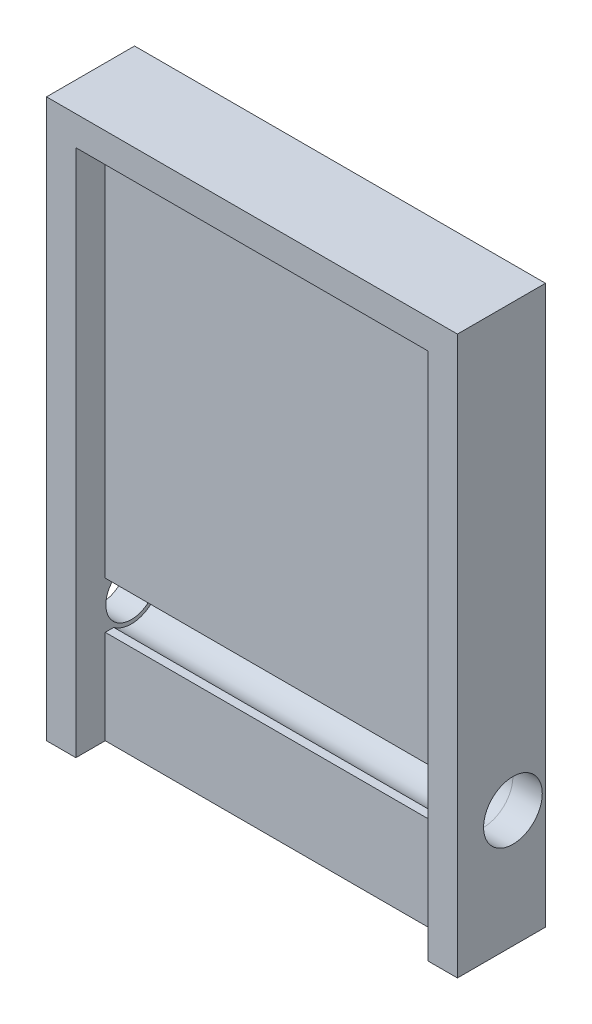
ISO-10303-21;
HEADER;
FILE_DESCRIPTION(('STEP AP214'),'2;1');
FILE_NAME('part.step','',(''),(''),'','','');
FILE_SCHEMA(('AUTOMOTIVE_DESIGN { 1 0 10303 214 1 1 1 1 }'));
ENDSEC;
DATA;
#1=APPLICATION_CONTEXT('core data for automotive mechanical design processes');
#2=APPLICATION_PROTOCOL_DEFINITION('international standard','automotive_design',2000,#1);
#3=PRODUCT_CONTEXT('',#1,'mechanical');
#4=PRODUCT('Part','Part','',(#3));
#5=PRODUCT_RELATED_PRODUCT_CATEGORY('part','',(#4));
#6=PRODUCT_DEFINITION_FORMATION('','',#4);
#7=PRODUCT_DEFINITION_CONTEXT('part definition',#1,'design');
#8=PRODUCT_DEFINITION('design','',#6,#7);
#9=PRODUCT_DEFINITION_SHAPE('','',#8);
#10=(LENGTH_UNIT() NAMED_UNIT(*) SI_UNIT(.MILLI.,.METRE.));
#11=(NAMED_UNIT(*) PLANE_ANGLE_UNIT() SI_UNIT($,.RADIAN.));
#12=(NAMED_UNIT(*) SI_UNIT($,.STERADIAN.) SOLID_ANGLE_UNIT());
#13=UNCERTAINTY_MEASURE_WITH_UNIT(LENGTH_MEASURE(1.E-05),#10,'distance_accuracy_value','');
#14=(GEOMETRIC_REPRESENTATION_CONTEXT(3) GLOBAL_UNCERTAINTY_ASSIGNED_CONTEXT((#13)) GLOBAL_UNIT_ASSIGNED_CONTEXT((#10,
#11,#12)) REPRESENTATION_CONTEXT('',''));
#15=CARTESIAN_POINT('',(0.,0.,0.));
#16=DIRECTION('',(0.,0.,1.));
#17=DIRECTION('',(1.,0.,0.));
#18=AXIS2_PLACEMENT_3D('',#15,#16,#17);
#19=CARTESIAN_POINT('',(0.,0.,10.));
#20=DIRECTION('',(0.,0.,-1.));
#21=DIRECTION('',(-1.,0.,0.));
#22=AXIS2_PLACEMENT_3D('',#19,#20,#21);
#23=PLANE('',#22);
#24=DIRECTION('',(0.,1.,0.));
#25=VECTOR('',#24,1.);
#26=CARTESIAN_POINT('',(30.,-47.5,10.));
#27=LINE('',#26,#25);
#28=CARTESIAN_POINT('',(30.,-47.5,10.));
#29=VERTEX_POINT('',#28);
#30=CARTESIAN_POINT('',(30.,-31.5,10.));
#31=VERTEX_POINT('',#30);
#32=EDGE_CURVE('E205',#29,#31,#27,.T.);
#33=ORIENTED_EDGE('',*,*,#32,.T.);
#34=DIRECTION('',(1.,0.,0.));
#35=VECTOR('',#34,1.);
#36=CARTESIAN_POINT('',(-30.,-31.5,10.));
#37=LINE('',#36,#35);
#38=CARTESIAN_POINT('',(-30.,-31.5,10.));
#39=VERTEX_POINT('',#38);
#40=EDGE_CURVE('E179',#39,#31,#37,.T.);
#41=ORIENTED_EDGE('',*,*,#40,.F.);
#42=DIRECTION('',(0.,-1.,0.));
#43=VECTOR('',#42,1.);
#44=CARTESIAN_POINT('',(-30.,-47.5,10.));
#45=LINE('',#44,#43);
#46=CARTESIAN_POINT('',(-30.,-47.5,10.));
#47=VERTEX_POINT('',#46);
#48=EDGE_CURVE('E200',#39,#47,#45,.T.);
#49=ORIENTED_EDGE('',*,*,#48,.T.);
#50=DIRECTION('',(1.,0.,0.));
#51=VECTOR('',#50,1.);
#52=CARTESIAN_POINT('',(-30.,-47.5,10.));
#53=LINE('',#52,#51);
#54=EDGE_CURVE('E199',#47,#29,#53,.T.);
#55=ORIENTED_EDGE('',*,*,#54,.T.);
#56=EDGE_LOOP('',(#33,#41,#49,#55));
#57=FACE_BOUND('',#56,.T.);
#58=ADVANCED_FACE('F45',(#57),#23,.F.);
#59=CARTESIAN_POINT('',(35.,47.5,15.));
#60=DIRECTION('',(0.,-1.,0.));
#61=DIRECTION('',(0.,0.,-1.));
#62=AXIS2_PLACEMENT_3D('',#59,#60,#61);
#63=PLANE('',#62);
#64=DIRECTION('',(-1.,0.,0.));
#65=VECTOR('',#64,1.);
#66=CARTESIAN_POINT('',(35.,47.5,0.));
#67=LINE('',#66,#65);
#68=CARTESIAN_POINT('',(35.,47.5,0.));
#69=VERTEX_POINT('',#68);
#70=CARTESIAN_POINT('',(-35.,47.5,0.));
#71=VERTEX_POINT('',#70);
#72=EDGE_CURVE('E227',#69,#71,#67,.T.);
#73=ORIENTED_EDGE('',*,*,#72,.T.);
#74=DIRECTION('',(0.,0.,-1.));
#75=VECTOR('',#74,1.);
#76=CARTESIAN_POINT('',(-35.,47.5,15.));
#77=LINE('',#76,#75);
#78=CARTESIAN_POINT('',(-35.,47.5,15.));
#79=VERTEX_POINT('',#78);
#80=EDGE_CURVE('E55',#79,#71,#77,.T.);
#81=ORIENTED_EDGE('',*,*,#80,.F.);
#82=DIRECTION('',(-1.,0.,0.));
#83=VECTOR('',#82,1.);
#84=CARTESIAN_POINT('',(35.,47.5,15.));
#85=LINE('',#84,#83);
#86=CARTESIAN_POINT('',(35.,47.5,15.));
#87=VERTEX_POINT('',#86);
#88=EDGE_CURVE('E237',#87,#79,#85,.T.);
#89=ORIENTED_EDGE('',*,*,#88,.F.);
#90=DIRECTION('',(0.,0.,-1.));
#91=VECTOR('',#90,1.);
#92=CARTESIAN_POINT('',(35.,47.5,15.));
#93=LINE('',#92,#91);
#94=EDGE_CURVE('E253',#87,#69,#93,.T.);
#95=ORIENTED_EDGE('',*,*,#94,.T.);
#96=EDGE_LOOP('',(#73,#81,#89,#95));
#97=FACE_BOUND('',#96,.T.);
#98=ADVANCED_FACE('F47',(#97),#63,.F.);
#99=CARTESIAN_POINT('',(-35.,-47.5,15.));
#100=DIRECTION('',(1.,0.,0.));
#101=DIRECTION('',(0.,0.,-1.));
#102=AXIS2_PLACEMENT_3D('',#99,#100,#101);
#103=PLANE('',#102);
#104=CARTESIAN_POINT('',(-35.,-27.5,5.54651922487887));
#105=DIRECTION('',(-1.,0.,0.));
#106=DIRECTION('',(0.,0.,1.));
#107=AXIS2_PLACEMENT_3D('',#104,#105,#106);
#108=CIRCLE('',#107,4.35);
#109=CARTESIAN_POINT('',(-35.,-27.5,9.89651922487887));
#110=VERTEX_POINT('',#109);
#111=EDGE_CURVE('E375',#110,#110,#108,.T.);
#112=ORIENTED_EDGE('',*,*,#111,.F.);
#113=EDGE_LOOP('',(#112));
#114=FACE_BOUND('',#113,.T.);
#115=DIRECTION('',(0.,-1.,0.));
#116=VECTOR('',#115,1.);
#117=CARTESIAN_POINT('',(-35.,-47.5,0.));
#118=LINE('',#117,#116);
#119=CARTESIAN_POINT('',(-35.,-47.5,0.));
#120=VERTEX_POINT('',#119);
#121=EDGE_CURVE('E257',#71,#120,#118,.T.);
#122=ORIENTED_EDGE('',*,*,#121,.T.);
#123=DIRECTION('',(0.,0.,-1.));
#124=VECTOR('',#123,1.);
#125=CARTESIAN_POINT('',(-35.,-47.5,15.));
#126=LINE('',#125,#124);
#127=CARTESIAN_POINT('',(-35.,-47.5,15.));
#128=VERTEX_POINT('',#127);
#129=EDGE_CURVE('E272',#128,#120,#126,.T.);
#130=ORIENTED_EDGE('',*,*,#129,.F.);
#131=DIRECTION('',(0.,-1.,0.));
#132=VECTOR('',#131,1.);
#133=CARTESIAN_POINT('',(-35.,-47.5,15.));
#134=LINE('',#133,#132);
#135=EDGE_CURVE('E241',#79,#128,#134,.T.);
#136=ORIENTED_EDGE('',*,*,#135,.F.);
#137=ORIENTED_EDGE('',*,*,#80,.T.);
#138=EDGE_LOOP('',(#122,#130,#136,#137));
#139=FACE_BOUND('',#138,.T.);
#140=ADVANCED_FACE('F280',(#114,#139),#103,.F.);
#141=CARTESIAN_POINT('',(35.,-47.5,15.));
#142=DIRECTION('',(0.,1.,0.));
#143=DIRECTION('',(0.,0.,1.));
#144=AXIS2_PLACEMENT_3D('',#141,#142,#143);
#145=PLANE('',#144);
#146=ORIENTED_EDGE('',*,*,#54,.F.);
#147=DIRECTION('',(0.,0.,1.));
#148=VECTOR('',#147,1.);
#149=CARTESIAN_POINT('',(-30.,-47.5,10.));
#150=LINE('',#149,#148);
#151=CARTESIAN_POINT('',(-30.,-47.5,15.));
#152=VERTEX_POINT('',#151);
#153=EDGE_CURVE('E213',#47,#152,#150,.T.);
#154=ORIENTED_EDGE('',*,*,#153,.T.);
#155=DIRECTION('',(1.,0.,0.));
#156=VECTOR('',#155,1.);
#157=CARTESIAN_POINT('',(35.,-47.5,15.));
#158=LINE('',#157,#156);
#159=EDGE_CURVE('E246',#128,#152,#158,.T.);
#160=ORIENTED_EDGE('',*,*,#159,.F.);
#161=ORIENTED_EDGE('',*,*,#129,.T.);
#162=DIRECTION('',(1.,0.,0.));
#163=VECTOR('',#162,1.);
#164=CARTESIAN_POINT('',(35.,-47.5,0.));
#165=LINE('',#164,#163);
#166=CARTESIAN_POINT('',(35.,-47.5,0.));
#167=VERTEX_POINT('',#166);
#168=EDGE_CURVE('E260',#120,#167,#165,.T.);
#169=ORIENTED_EDGE('',*,*,#168,.T.);
#170=DIRECTION('',(0.,0.,-1.));
#171=VECTOR('',#170,1.);
#172=CARTESIAN_POINT('',(35.,-47.5,15.));
#173=LINE('',#172,#171);
#174=CARTESIAN_POINT('',(35.,-47.5,15.));
#175=VERTEX_POINT('',#174);
#176=EDGE_CURVE('E268',#175,#167,#173,.T.);
#177=ORIENTED_EDGE('',*,*,#176,.F.);
#178=CARTESIAN_POINT('',(30.,-47.5,15.));
#179=VERTEX_POINT('',#178);
#180=EDGE_CURVE('E245',#179,#175,#158,.T.);
#181=ORIENTED_EDGE('',*,*,#180,.F.);
#182=DIRECTION('',(0.,0.,1.));
#183=VECTOR('',#182,1.);
#184=CARTESIAN_POINT('',(30.,-47.5,10.));
#185=LINE('',#184,#183);
#186=EDGE_CURVE('E231',#29,#179,#185,.T.);
#187=ORIENTED_EDGE('',*,*,#186,.F.);
#188=EDGE_LOOP('',(#146,#154,#160,#161,#169,#177,#181,#187));
#189=FACE_BOUND('',#188,.T.);
#190=ADVANCED_FACE('F293',(#189),#145,.F.);
#191=CARTESIAN_POINT('',(35.,-47.5,15.));
#192=DIRECTION('',(-1.,0.,0.));
#193=DIRECTION('',(0.,0.,1.));
#194=AXIS2_PLACEMENT_3D('',#191,#192,#193);
#195=PLANE('',#194);
#196=CARTESIAN_POINT('',(35.,-27.5,5.54651922487887));
#197=DIRECTION('',(1.,0.,0.));
#198=DIRECTION('',(0.,0.,-1.));
#199=AXIS2_PLACEMENT_3D('',#196,#197,#198);
#200=CIRCLE('',#199,5.);
#201=CARTESIAN_POINT('',(35.,-27.5,0.546519224878866));
#202=VERTEX_POINT('',#201);
#203=EDGE_CURVE('E158',#202,#202,#200,.T.);
#204=ORIENTED_EDGE('',*,*,#203,.F.);
#205=EDGE_LOOP('',(#204));
#206=FACE_BOUND('',#205,.T.);
#207=DIRECTION('',(0.,1.,0.));
#208=VECTOR('',#207,1.);
#209=CARTESIAN_POINT('',(35.,-47.5,0.));
#210=LINE('',#209,#208);
#211=EDGE_CURVE('E242',#167,#69,#210,.T.);
#212=ORIENTED_EDGE('',*,*,#211,.T.);
#213=ORIENTED_EDGE('',*,*,#94,.F.);
#214=DIRECTION('',(0.,1.,0.));
#215=VECTOR('',#214,1.);
#216=CARTESIAN_POINT('',(35.,-47.5,15.));
#217=LINE('',#216,#215);
#218=EDGE_CURVE('E250',#175,#87,#217,.T.);
#219=ORIENTED_EDGE('',*,*,#218,.F.);
#220=ORIENTED_EDGE('',*,*,#176,.T.);
#221=EDGE_LOOP('',(#212,#213,#219,#220));
#222=FACE_BOUND('',#221,.T.);
#223=ADVANCED_FACE('F298',(#206,#222),#195,.F.);
#224=CARTESIAN_POINT('',(0.,0.,15.));
#225=DIRECTION('',(0.,0.,-1.));
#226=DIRECTION('',(-1.,0.,0.));
#227=AXIS2_PLACEMENT_3D('',#224,#225,#226);
#228=PLANE('',#227);
#229=ORIENTED_EDGE('',*,*,#159,.T.);
#230=DIRECTION('',(0.,-1.,0.));
#231=VECTOR('',#230,1.);
#232=CARTESIAN_POINT('',(-30.,-47.5,15.));
#233=LINE('',#232,#231);
#234=CARTESIAN_POINT('',(-30.,42.5,15.));
#235=VERTEX_POINT('',#234);
#236=EDGE_CURVE('E186',#235,#152,#233,.T.);
#237=ORIENTED_EDGE('',*,*,#236,.F.);
#238=DIRECTION('',(-1.,0.,0.));
#239=VECTOR('',#238,1.);
#240=CARTESIAN_POINT('',(-30.,42.5,15.));
#241=LINE('',#240,#239);
#242=CARTESIAN_POINT('',(30.,42.5,15.));
#243=VERTEX_POINT('',#242);
#244=EDGE_CURVE('E220',#243,#235,#241,.T.);
#245=ORIENTED_EDGE('',*,*,#244,.F.);
#246=DIRECTION('',(0.,1.,0.));
#247=VECTOR('',#246,1.);
#248=CARTESIAN_POINT('',(30.,-47.5,15.));
#249=LINE('',#248,#247);
#250=EDGE_CURVE('E216',#179,#243,#249,.T.);
#251=ORIENTED_EDGE('',*,*,#250,.F.);
#252=ORIENTED_EDGE('',*,*,#180,.T.);
#253=ORIENTED_EDGE('',*,*,#218,.T.);
#254=ORIENTED_EDGE('',*,*,#88,.T.);
#255=ORIENTED_EDGE('',*,*,#135,.T.);
#256=EDGE_LOOP('',(#229,#237,#245,#251,#252,#253,#254,#255));
#257=FACE_BOUND('',#256,.T.);
#258=ADVANCED_FACE('F300',(#257),#228,.F.);
#259=CARTESIAN_POINT('',(0.,0.,0.));
#260=DIRECTION('',(0.,0.,-1.));
#261=DIRECTION('',(-1.,0.,0.));
#262=AXIS2_PLACEMENT_3D('',#259,#260,#261);
#263=PLANE('',#262);
#264=ORIENTED_EDGE('',*,*,#72,.F.);
#265=ORIENTED_EDGE('',*,*,#211,.F.);
#266=ORIENTED_EDGE('',*,*,#168,.F.);
#267=ORIENTED_EDGE('',*,*,#121,.F.);
#268=EDGE_LOOP('',(#264,#265,#266,#267));
#269=FACE_BOUND('',#268,.T.);
#270=ADVANCED_FACE('F288',(#269),#263,.T.);
#271=CARTESIAN_POINT('',(-30.,-47.5,10.));
#272=DIRECTION('',(-1.,0.,0.));
#273=DIRECTION('',(0.,0.,1.));
#274=AXIS2_PLACEMENT_3D('',#271,#272,#273);
#275=PLANE('',#274);
#276=CARTESIAN_POINT('',(-30.,-27.5,5.54651922487887));
#277=DIRECTION('',(-1.,0.,0.));
#278=DIRECTION('',(0.,0.,1.));
#279=AXIS2_PLACEMENT_3D('',#276,#277,#278);
#280=CIRCLE('',#279,4.35);
#281=CARTESIAN_POINT('',(-30.,-27.5,9.89651922487887));
#282=VERTEX_POINT('',#281);
#283=EDGE_CURVE('E49',#282,#282,#280,.T.);
#284=ORIENTED_EDGE('',*,*,#283,.T.);
#285=EDGE_LOOP('',(#284));
#286=FACE_BOUND('',#285,.T.);
#287=DIRECTION('',(0.,0.,1.));
#288=VECTOR('',#287,1.);
#289=CARTESIAN_POINT('',(-30.,-31.5,5.55));
#290=LINE('',#289,#288);
#291=CARTESIAN_POINT('',(-30.,-31.5,8.54999999999999));
#292=VERTEX_POINT('',#291);
#293=EDGE_CURVE('E187',#292,#39,#290,.T.);
#294=ORIENTED_EDGE('',*,*,#293,.F.);
#295=CARTESIAN_POINT('',(-30.,-27.5,5.55));
#296=DIRECTION('',(1.,0.,0.));
#297=DIRECTION('',(0.,1.,0.));
#298=AXIS2_PLACEMENT_3D('',#295,#296,#297);
#299=CIRCLE('',#298,5.);
#300=CARTESIAN_POINT('',(-30.,-23.5,8.55000000000001));
#301=VERTEX_POINT('',#300);
#302=EDGE_CURVE('E174',#292,#301,#299,.T.);
#303=ORIENTED_EDGE('',*,*,#302,.T.);
#304=DIRECTION('',(0.,0.,1.));
#305=VECTOR('',#304,1.);
#306=CARTESIAN_POINT('',(-30.,-23.5,5.55));
#307=LINE('',#306,#305);
#308=CARTESIAN_POINT('',(-30.,-23.5,10.));
#309=VERTEX_POINT('',#308);
#310=EDGE_CURVE('E190',#301,#309,#307,.T.);
#311=ORIENTED_EDGE('',*,*,#310,.T.);
#312=CARTESIAN_POINT('',(-30.,42.5,10.));
#313=VERTEX_POINT('',#312);
#314=EDGE_CURVE('E195',#313,#309,#45,.T.);
#315=ORIENTED_EDGE('',*,*,#314,.F.);
#316=DIRECTION('',(0.,0.,1.));
#317=VECTOR('',#316,1.);
#318=CARTESIAN_POINT('',(-30.,42.5,10.));
#319=LINE('',#318,#317);
#320=EDGE_CURVE('E224',#313,#235,#319,.T.);
#321=ORIENTED_EDGE('',*,*,#320,.T.);
#322=ORIENTED_EDGE('',*,*,#236,.T.);
#323=ORIENTED_EDGE('',*,*,#153,.F.);
#324=ORIENTED_EDGE('',*,*,#48,.F.);
#325=EDGE_LOOP('',(#294,#303,#311,#315,#321,#322,#323,#324));
#326=FACE_BOUND('',#325,.T.);
#327=ADVANCED_FACE('F313',(#286,#326),#275,.F.);
#328=CARTESIAN_POINT('',(-30.,42.5,10.));
#329=DIRECTION('',(0.,1.,0.));
#330=DIRECTION('',(0.,0.,1.));
#331=AXIS2_PLACEMENT_3D('',#328,#329,#330);
#332=PLANE('',#331);
#333=ORIENTED_EDGE('',*,*,#244,.T.);
#334=ORIENTED_EDGE('',*,*,#320,.F.);
#335=DIRECTION('',(-1.,0.,0.));
#336=VECTOR('',#335,1.);
#337=CARTESIAN_POINT('',(-30.,42.5,10.));
#338=LINE('',#337,#336);
#339=CARTESIAN_POINT('',(30.,42.5,10.));
#340=VERTEX_POINT('',#339);
#341=EDGE_CURVE('E209',#340,#313,#338,.T.);
#342=ORIENTED_EDGE('',*,*,#341,.F.);
#343=DIRECTION('',(0.,0.,1.));
#344=VECTOR('',#343,1.);
#345=CARTESIAN_POINT('',(30.,42.5,10.));
#346=LINE('',#345,#344);
#347=EDGE_CURVE('E228',#340,#243,#346,.T.);
#348=ORIENTED_EDGE('',*,*,#347,.T.);
#349=EDGE_LOOP('',(#333,#334,#342,#348));
#350=FACE_BOUND('',#349,.T.);
#351=ADVANCED_FACE('F328',(#350),#332,.F.);
#352=CARTESIAN_POINT('',(30.,-47.5,10.));
#353=DIRECTION('',(1.,0.,0.));
#354=DIRECTION('',(0.,0.,-1.));
#355=AXIS2_PLACEMENT_3D('',#352,#353,#354);
#356=PLANE('',#355);
#357=CARTESIAN_POINT('',(30.,-27.5,5.54651922487887));
#358=DIRECTION('',(1.,0.,0.));
#359=DIRECTION('',(0.,0.,-1.));
#360=AXIS2_PLACEMENT_3D('',#357,#358,#359);
#361=CIRCLE('',#360,5.);
#362=CARTESIAN_POINT('',(30.,-22.5000003028949,5.54825961243943));
#363=VERTEX_POINT('',#362);
#364=CARTESIAN_POINT('',(30.,-32.4999996971051,5.54825961243943));
#365=VERTEX_POINT('',#364);
#366=EDGE_CURVE('E62',#363,#365,#361,.T.);
#367=ORIENTED_EDGE('',*,*,#366,.T.);
#368=CARTESIAN_POINT('',(30.,-27.5,5.55));
#369=DIRECTION('',(1.,0.,0.));
#370=DIRECTION('',(0.,1.,0.));
#371=AXIS2_PLACEMENT_3D('',#368,#369,#370);
#372=CIRCLE('',#371,5.);
#373=CARTESIAN_POINT('',(30.,-31.5,8.55000000000001));
#374=VERTEX_POINT('',#373);
#375=EDGE_CURVE('E149',#374,#365,#372,.T.);
#376=ORIENTED_EDGE('',*,*,#375,.F.);
#377=DIRECTION('',(0.,0.,1.));
#378=VECTOR('',#377,1.);
#379=CARTESIAN_POINT('',(30.,-31.5,5.55));
#380=LINE('',#379,#378);
#381=EDGE_CURVE('E183',#374,#31,#380,.T.);
#382=ORIENTED_EDGE('',*,*,#381,.T.);
#383=ORIENTED_EDGE('',*,*,#32,.F.);
#384=ORIENTED_EDGE('',*,*,#186,.T.);
#385=ORIENTED_EDGE('',*,*,#250,.T.);
#386=ORIENTED_EDGE('',*,*,#347,.F.);
#387=CARTESIAN_POINT('',(30.,-23.5,10.));
#388=VERTEX_POINT('',#387);
#389=EDGE_CURVE('E204',#388,#340,#27,.T.);
#390=ORIENTED_EDGE('',*,*,#389,.F.);
#391=DIRECTION('',(0.,0.,1.));
#392=VECTOR('',#391,1.);
#393=CARTESIAN_POINT('',(30.,-23.5,5.55));
#394=LINE('',#393,#392);
#395=CARTESIAN_POINT('',(30.,-23.5,8.54999999999999));
#396=VERTEX_POINT('',#395);
#397=EDGE_CURVE('E69',#396,#388,#394,.T.);
#398=ORIENTED_EDGE('',*,*,#397,.F.);
#399=EDGE_CURVE('E150',#363,#396,#372,.T.);
#400=ORIENTED_EDGE('',*,*,#399,.F.);
#401=EDGE_LOOP('',(#367,#376,#382,#383,#384,#385,#386,#390,#398,#400));
#402=FACE_BOUND('',#401,.T.);
#403=ADVANCED_FACE('F155',(#402),#356,.F.);
#404=ORIENTED_EDGE('',*,*,#314,.T.);
#405=DIRECTION('',(-1.,0.,0.));
#406=VECTOR('',#405,1.);
#407=CARTESIAN_POINT('',(-30.,-23.5,10.));
#408=LINE('',#407,#406);
#409=EDGE_CURVE('E165',#388,#309,#408,.T.);
#410=ORIENTED_EDGE('',*,*,#409,.F.);
#411=ORIENTED_EDGE('',*,*,#389,.T.);
#412=ORIENTED_EDGE('',*,*,#341,.T.);
#413=EDGE_LOOP('',(#404,#410,#411,#412));
#414=FACE_BOUND('',#413,.T.);
#415=ADVANCED_FACE('F325',(#414),#23,.F.);
#416=CARTESIAN_POINT('',(-30.,-31.5,5.55));
#417=DIRECTION('',(0.,-1.,0.));
#418=DIRECTION('',(0.,0.,-1.));
#419=AXIS2_PLACEMENT_3D('',#416,#417,#418);
#420=PLANE('',#419);
#421=ORIENTED_EDGE('',*,*,#381,.F.);
#422=DIRECTION('',(1.,0.,0.));
#423=VECTOR('',#422,1.);
#424=CARTESIAN_POINT('',(30.,-31.5,8.55000000000001));
#425=LINE('',#424,#423);
#426=EDGE_CURVE('E161',#374,#292,#425,.F.);
#427=ORIENTED_EDGE('',*,*,#426,.T.);
#428=ORIENTED_EDGE('',*,*,#293,.T.);
#429=ORIENTED_EDGE('',*,*,#40,.T.);
#430=EDGE_LOOP('',(#421,#427,#428,#429));
#431=FACE_BOUND('',#430,.T.);
#432=ADVANCED_FACE('F317',(#431),#420,.F.);
#433=CARTESIAN_POINT('',(-30.,-23.5,5.55));
#434=DIRECTION('',(0.,1.,0.));
#435=DIRECTION('',(0.,0.,1.));
#436=AXIS2_PLACEMENT_3D('',#433,#434,#435);
#437=PLANE('',#436);
#438=ORIENTED_EDGE('',*,*,#310,.F.);
#439=DIRECTION('',(1.,0.,0.));
#440=VECTOR('',#439,1.);
#441=CARTESIAN_POINT('',(30.,-23.5,8.54999999999999));
#442=LINE('',#441,#440);
#443=EDGE_CURVE('E11',#301,#396,#442,.T.);
#444=ORIENTED_EDGE('',*,*,#443,.T.);
#445=ORIENTED_EDGE('',*,*,#397,.T.);
#446=ORIENTED_EDGE('',*,*,#409,.T.);
#447=EDGE_LOOP('',(#438,#444,#445,#446));
#448=FACE_BOUND('',#447,.T.);
#449=ADVANCED_FACE('F322',(#448),#437,.F.);
#450=CARTESIAN_POINT('',(30.,-27.5,5.55));
#451=DIRECTION('',(1.,0.,0.));
#452=DIRECTION('',(0.,1.,0.));
#453=AXIS2_PLACEMENT_3D('',#450,#451,#452);
#454=CYLINDRICAL_SURFACE('',#453,5.);
#455=ORIENTED_EDGE('',*,*,#375,.T.);
#456=CARTESIAN_POINT('',(30.,-27.5,5.55));
#457=DIRECTION('',(1.,0.,0.));
#458=DIRECTION('',(0.,-0.999999939421021,-0.000348077512113236));
#459=AXIS2_PLACEMENT_3D('',#456,#457,#458);
#460=CIRCLE('',#459,5.);
#461=EDGE_CURVE('E142',#365,#363,#460,.T.);
#462=ORIENTED_EDGE('',*,*,#461,.T.);
#463=ORIENTED_EDGE('',*,*,#399,.T.);
#464=ORIENTED_EDGE('',*,*,#443,.F.);
#465=ORIENTED_EDGE('',*,*,#302,.F.);
#466=ORIENTED_EDGE('',*,*,#426,.F.);
#467=EDGE_LOOP('',(#455,#462,#463,#464,#465,#466));
#468=FACE_BOUND('',#467,.T.);
#469=ADVANCED_FACE('F159',(#468),#454,.F.);
#470=CARTESIAN_POINT('',(35.,-27.5,5.54651922487887));
#471=DIRECTION('',(-1.,0.,0.));
#472=DIRECTION('',(0.,0.,1.));
#473=AXIS2_PLACEMENT_3D('',#470,#471,#472);
#474=CYLINDRICAL_SURFACE('',#473,5.);
#475=ORIENTED_EDGE('',*,*,#203,.T.);
#476=EDGE_LOOP('',(#475));
#477=FACE_BOUND('',#476,.T.);
#478=ORIENTED_EDGE('',*,*,#366,.F.);
#479=ORIENTED_EDGE('',*,*,#461,.F.);
#480=EDGE_LOOP('',(#478,#479));
#481=FACE_BOUND('',#480,.T.);
#482=ADVANCED_FACE('F144',(#477,#481),#474,.F.);
#483=CARTESIAN_POINT('',(35.,-27.5,5.54651922487887));
#484=DIRECTION('',(-1.,0.,0.));
#485=DIRECTION('',(0.,0.,1.));
#486=AXIS2_PLACEMENT_3D('',#483,#484,#485);
#487=CYLINDRICAL_SURFACE('',#486,4.35);
#488=ORIENTED_EDGE('',*,*,#111,.T.);
#489=EDGE_LOOP('',(#488));
#490=FACE_BOUND('',#489,.T.);
#491=ORIENTED_EDGE('',*,*,#283,.F.);
#492=EDGE_LOOP('',(#491));
#493=FACE_BOUND('',#492,.T.);
#494=ADVANCED_FACE('F359',(#490,#493),#487,.F.);
#495=CLOSED_SHELL('',(#58,#98,#140,#190,#223,#258,#270,#327,#351,#403,#415,#432,#449,#469,#482,#494));
#496=MANIFOLD_SOLID_BREP('B2',#495);
#497=ADVANCED_BREP_SHAPE_REPRESENTATION('',(#18,#496),#14);
#498=SHAPE_DEFINITION_REPRESENTATION(#9,#497);
ENDSEC;
END-ISO-10303-21;
